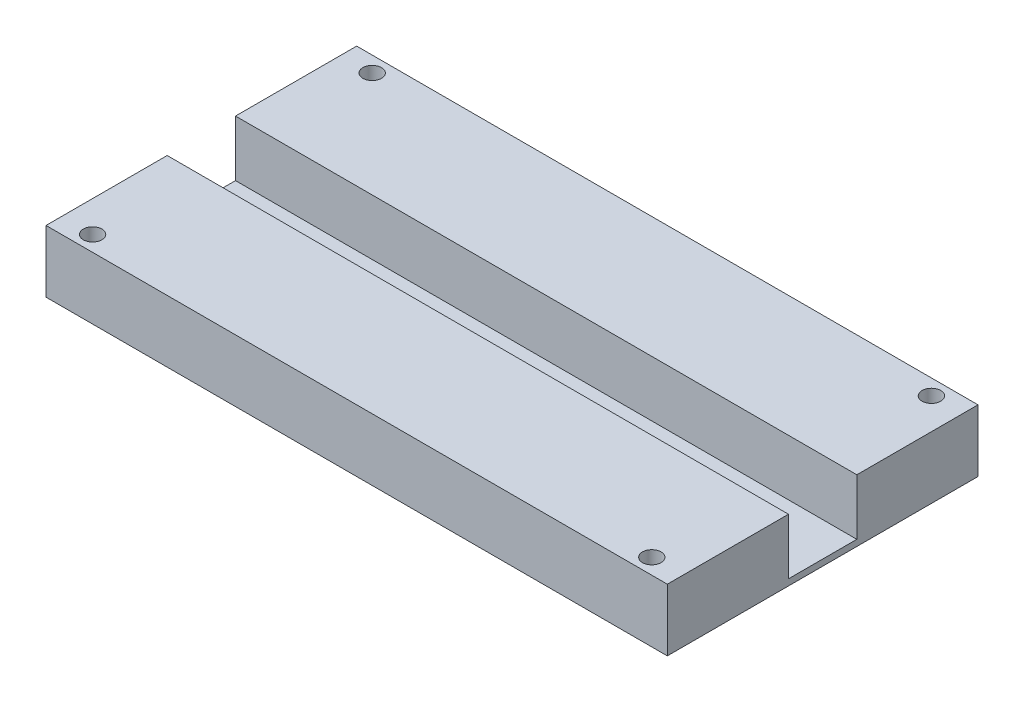
ISO-10303-21;
HEADER;
FILE_DESCRIPTION(('STEP AP214'),'2;1');
FILE_NAME('part.step','',(''),(''),'','','');
FILE_SCHEMA(('AUTOMOTIVE_DESIGN { 1 0 10303 214 1 1 1 1 }'));
ENDSEC;
DATA;
#1=APPLICATION_CONTEXT('core data for automotive mechanical design processes');
#2=APPLICATION_PROTOCOL_DEFINITION('international standard','automotive_design',2000,#1);
#3=PRODUCT_CONTEXT('',#1,'mechanical');
#4=PRODUCT('Part','Part','',(#3));
#5=PRODUCT_RELATED_PRODUCT_CATEGORY('part','',(#4));
#6=PRODUCT_DEFINITION_FORMATION('','',#4);
#7=PRODUCT_DEFINITION_CONTEXT('part definition',#1,'design');
#8=PRODUCT_DEFINITION('design','',#6,#7);
#9=PRODUCT_DEFINITION_SHAPE('','',#8);
#10=(LENGTH_UNIT() NAMED_UNIT(*) SI_UNIT(.MILLI.,.METRE.));
#11=(NAMED_UNIT(*) PLANE_ANGLE_UNIT() SI_UNIT($,.RADIAN.));
#12=(NAMED_UNIT(*) SI_UNIT($,.STERADIAN.) SOLID_ANGLE_UNIT());
#13=UNCERTAINTY_MEASURE_WITH_UNIT(LENGTH_MEASURE(1.E-05),#10,'distance_accuracy_value','');
#14=(GEOMETRIC_REPRESENTATION_CONTEXT(3) GLOBAL_UNCERTAINTY_ASSIGNED_CONTEXT((#13)) GLOBAL_UNIT_ASSIGNED_CONTEXT((#10,
#11,#12)) REPRESENTATION_CONTEXT('',''));
#15=CARTESIAN_POINT('',(0.,0.,0.));
#16=DIRECTION('',(0.,0.,1.));
#17=DIRECTION('',(1.,0.,0.));
#18=AXIS2_PLACEMENT_3D('',#15,#16,#17);
#19=CARTESIAN_POINT('',(0.,10.,0.));
#20=DIRECTION('',(0.,-1.,0.));
#21=DIRECTION('',(0.,0.,-1.));
#22=AXIS2_PLACEMENT_3D('',#19,#20,#21);
#23=PLANE('',#22);
#24=CARTESIAN_POINT('',(64.9999999999999,10.,27.5));
#25=DIRECTION('',(0.,1.,0.));
#26=DIRECTION('',(0.,0.,1.));
#27=AXIS2_PLACEMENT_3D('',#24,#25,#26);
#28=CIRCLE('',#27,1.5);
#29=CARTESIAN_POINT('',(64.9999999999999,10.,29.));
#30=VERTEX_POINT('',#29);
#31=EDGE_CURVE('E135',#30,#30,#28,.T.);
#32=ORIENTED_EDGE('',*,*,#31,.F.);
#33=EDGE_LOOP('',(#32));
#34=FACE_BOUND('',#33,.T.);
#35=CARTESIAN_POINT('',(-25.,10.,27.5));
#36=DIRECTION('',(0.,1.,0.));
#37=DIRECTION('',(0.,0.,1.));
#38=AXIS2_PLACEMENT_3D('',#35,#36,#37);
#39=CIRCLE('',#38,1.5);
#40=CARTESIAN_POINT('',(-25.,10.,29.));
#41=VERTEX_POINT('',#40);
#42=EDGE_CURVE('E149',#41,#41,#39,.T.);
#43=ORIENTED_EDGE('',*,*,#42,.F.);
#44=EDGE_LOOP('',(#43));
#45=FACE_BOUND('',#44,.T.);
#46=DIRECTION('',(0.,0.,-1.));
#47=VECTOR('',#46,1.);
#48=CARTESIAN_POINT('',(70.,10.,30.));
#49=LINE('',#48,#47);
#50=CARTESIAN_POINT('',(70.,10.,30.));
#51=VERTEX_POINT('',#50);
#52=CARTESIAN_POINT('',(70.,10.,10.5));
#53=VERTEX_POINT('',#52);
#54=EDGE_CURVE('E161',#51,#53,#49,.T.);
#55=ORIENTED_EDGE('',*,*,#54,.T.);
#56=DIRECTION('',(1.,0.,0.));
#57=VECTOR('',#56,1.);
#58=CARTESIAN_POINT('',(70.,10.,10.5));
#59=LINE('',#58,#57);
#60=CARTESIAN_POINT('',(-30.0000000000001,10.,10.5));
#61=VERTEX_POINT('',#60);
#62=EDGE_CURVE('E126',#61,#53,#59,.T.);
#63=ORIENTED_EDGE('',*,*,#62,.F.);
#64=DIRECTION('',(0.,0.,1.));
#65=VECTOR('',#64,1.);
#66=CARTESIAN_POINT('',(-30.0000000000001,10.,30.));
#67=LINE('',#66,#65);
#68=CARTESIAN_POINT('',(-30.0000000000001,10.,30.));
#69=VERTEX_POINT('',#68);
#70=EDGE_CURVE('E165',#61,#69,#67,.T.);
#71=ORIENTED_EDGE('',*,*,#70,.T.);
#72=DIRECTION('',(1.,0.,0.));
#73=VECTOR('',#72,1.);
#74=CARTESIAN_POINT('',(-30.0000000000001,10.,30.));
#75=LINE('',#74,#73);
#76=EDGE_CURVE('E60',#69,#51,#75,.T.);
#77=ORIENTED_EDGE('',*,*,#76,.T.);
#78=EDGE_LOOP('',(#55,#63,#71,#77));
#79=FACE_BOUND('',#78,.T.);
#80=ADVANCED_FACE('F36',(#34,#45,#79),#23,.F.);
#81=CARTESIAN_POINT('',(-30.0000000000001,10.,-20.));
#82=VERTEX_POINT('',#81);
#83=CARTESIAN_POINT('',(-30.0000000000001,10.,-0.499999999999985));
#84=VERTEX_POINT('',#83);
#85=EDGE_CURVE('E166',#82,#84,#67,.T.);
#86=ORIENTED_EDGE('',*,*,#85,.T.);
#87=DIRECTION('',(-1.,0.,0.));
#88=VECTOR('',#87,1.);
#89=CARTESIAN_POINT('',(70.,10.,-0.499999999999997));
#90=LINE('',#89,#88);
#91=CARTESIAN_POINT('',(70.,10.,-0.499999999999997));
#92=VERTEX_POINT('',#91);
#93=EDGE_CURVE('E198',#92,#84,#90,.T.);
#94=ORIENTED_EDGE('',*,*,#93,.F.);
#95=CARTESIAN_POINT('',(70.,10.,-20.));
#96=VERTEX_POINT('',#95);
#97=EDGE_CURVE('E89',#92,#96,#49,.T.);
#98=ORIENTED_EDGE('',*,*,#97,.T.);
#99=DIRECTION('',(-1.,0.,0.));
#100=VECTOR('',#99,1.);
#101=CARTESIAN_POINT('',(-30.0000000000001,10.,-20.));
#102=LINE('',#101,#100);
#103=EDGE_CURVE('E163',#96,#82,#102,.T.);
#104=ORIENTED_EDGE('',*,*,#103,.T.);
#105=EDGE_LOOP('',(#86,#94,#98,#104));
#106=FACE_BOUND('',#105,.T.);
#107=CARTESIAN_POINT('',(-25.,10.,-17.5));
#108=DIRECTION('',(0.,1.,0.));
#109=DIRECTION('',(0.,0.,1.));
#110=AXIS2_PLACEMENT_3D('',#107,#108,#109);
#111=CIRCLE('',#110,1.5);
#112=CARTESIAN_POINT('',(-25.,10.,-16.));
#113=VERTEX_POINT('',#112);
#114=EDGE_CURVE('E155',#113,#113,#111,.T.);
#115=ORIENTED_EDGE('',*,*,#114,.F.);
#116=EDGE_LOOP('',(#115));
#117=FACE_BOUND('',#116,.T.);
#118=CARTESIAN_POINT('',(64.9999999999999,10.,-17.5));
#119=DIRECTION('',(0.,1.,0.));
#120=DIRECTION('',(0.,0.,1.));
#121=AXIS2_PLACEMENT_3D('',#118,#119,#120);
#122=CIRCLE('',#121,1.5);
#123=CARTESIAN_POINT('',(64.9999999999999,10.,-16.));
#124=VERTEX_POINT('',#123);
#125=EDGE_CURVE('E143',#124,#124,#122,.T.);
#126=ORIENTED_EDGE('',*,*,#125,.F.);
#127=EDGE_LOOP('',(#126));
#128=FACE_BOUND('',#127,.T.);
#129=ADVANCED_FACE('F216',(#106,#117,#128),#23,.F.);
#130=CARTESIAN_POINT('',(0.,0.,0.));
#131=DIRECTION('',(0.,-1.,0.));
#132=DIRECTION('',(0.,0.,-1.));
#133=AXIS2_PLACEMENT_3D('',#130,#131,#132);
#134=PLANE('',#133);
#135=CARTESIAN_POINT('',(64.9999999999999,0.,-17.5));
#136=DIRECTION('',(0.,1.,0.));
#137=DIRECTION('',(0.,0.,1.));
#138=AXIS2_PLACEMENT_3D('',#135,#136,#137);
#139=CIRCLE('',#138,1.5);
#140=CARTESIAN_POINT('',(64.9999999999999,0.,-16.));
#141=VERTEX_POINT('',#140);
#142=EDGE_CURVE('E138',#141,#141,#139,.T.);
#143=ORIENTED_EDGE('',*,*,#142,.T.);
#144=EDGE_LOOP('',(#143));
#145=FACE_BOUND('',#144,.T.);
#146=CARTESIAN_POINT('',(-25.,0.,-17.5));
#147=DIRECTION('',(0.,1.,0.));
#148=DIRECTION('',(0.,0.,1.));
#149=AXIS2_PLACEMENT_3D('',#146,#147,#148);
#150=CIRCLE('',#149,1.5);
#151=CARTESIAN_POINT('',(-25.,0.,-16.));
#152=VERTEX_POINT('',#151);
#153=EDGE_CURVE('E152',#152,#152,#150,.T.);
#154=ORIENTED_EDGE('',*,*,#153,.T.);
#155=EDGE_LOOP('',(#154));
#156=FACE_BOUND('',#155,.T.);
#157=DIRECTION('',(0.,0.,-1.));
#158=VECTOR('',#157,1.);
#159=CARTESIAN_POINT('',(70.,0.,30.));
#160=LINE('',#159,#158);
#161=CARTESIAN_POINT('',(70.,0.,30.));
#162=VERTEX_POINT('',#161);
#163=CARTESIAN_POINT('',(70.,0.,-20.));
#164=VERTEX_POINT('',#163);
#165=EDGE_CURVE('E158',#162,#164,#160,.T.);
#166=ORIENTED_EDGE('',*,*,#165,.F.);
#167=DIRECTION('',(1.,0.,0.));
#168=VECTOR('',#167,1.);
#169=CARTESIAN_POINT('',(-30.0000000000001,0.,30.));
#170=LINE('',#169,#168);
#171=CARTESIAN_POINT('',(-30.0000000000001,0.,30.));
#172=VERTEX_POINT('',#171);
#173=EDGE_CURVE('E81',#172,#162,#170,.T.);
#174=ORIENTED_EDGE('',*,*,#173,.F.);
#175=DIRECTION('',(0.,0.,1.));
#176=VECTOR('',#175,1.);
#177=CARTESIAN_POINT('',(-30.0000000000001,0.,30.));
#178=LINE('',#177,#176);
#179=CARTESIAN_POINT('',(-30.0000000000001,0.,-20.));
#180=VERTEX_POINT('',#179);
#181=EDGE_CURVE('E175',#180,#172,#178,.T.);
#182=ORIENTED_EDGE('',*,*,#181,.F.);
#183=DIRECTION('',(-1.,0.,0.));
#184=VECTOR('',#183,1.);
#185=CARTESIAN_POINT('',(-30.0000000000001,0.,-20.));
#186=LINE('',#185,#184);
#187=EDGE_CURVE('E173',#164,#180,#186,.T.);
#188=ORIENTED_EDGE('',*,*,#187,.F.);
#189=EDGE_LOOP('',(#166,#174,#182,#188));
#190=FACE_BOUND('',#189,.T.);
#191=CARTESIAN_POINT('',(-25.,0.,27.5));
#192=DIRECTION('',(0.,1.,0.));
#193=DIRECTION('',(0.,0.,1.));
#194=AXIS2_PLACEMENT_3D('',#191,#192,#193);
#195=CIRCLE('',#194,1.5);
#196=CARTESIAN_POINT('',(-25.,0.,29.));
#197=VERTEX_POINT('',#196);
#198=EDGE_CURVE('E146',#197,#197,#195,.T.);
#199=ORIENTED_EDGE('',*,*,#198,.T.);
#200=EDGE_LOOP('',(#199));
#201=FACE_BOUND('',#200,.T.);
#202=CARTESIAN_POINT('',(64.9999999999999,0.,27.5));
#203=DIRECTION('',(0.,1.,0.));
#204=DIRECTION('',(0.,0.,1.));
#205=AXIS2_PLACEMENT_3D('',#202,#203,#204);
#206=CIRCLE('',#205,1.5);
#207=CARTESIAN_POINT('',(64.9999999999999,0.,29.));
#208=VERTEX_POINT('',#207);
#209=EDGE_CURVE('E139',#208,#208,#206,.T.);
#210=ORIENTED_EDGE('',*,*,#209,.T.);
#211=EDGE_LOOP('',(#210));
#212=FACE_BOUND('',#211,.T.);
#213=ADVANCED_FACE('F191',(#145,#156,#190,#201,#212),#134,.T.);
#214=CARTESIAN_POINT('',(70.,10.,30.));
#215=DIRECTION('',(-1.,0.,0.));
#216=DIRECTION('',(0.,0.,1.));
#217=AXIS2_PLACEMENT_3D('',#214,#215,#216);
#218=PLANE('',#217);
#219=DIRECTION('',(0.,0.,-1.));
#220=VECTOR('',#219,1.);
#221=CARTESIAN_POINT('',(70.,1.,-0.499999999999997));
#222=LINE('',#221,#220);
#223=CARTESIAN_POINT('',(70.,1.,10.5));
#224=VERTEX_POINT('',#223);
#225=CARTESIAN_POINT('',(70.,1.,-0.499999999999997));
#226=VERTEX_POINT('',#225);
#227=EDGE_CURVE('E117',#224,#226,#222,.T.);
#228=ORIENTED_EDGE('',*,*,#227,.F.);
#229=DIRECTION('',(0.,1.,0.));
#230=VECTOR('',#229,1.);
#231=CARTESIAN_POINT('',(70.,1.,10.5));
#232=LINE('',#231,#230);
#233=EDGE_CURVE('E142',#224,#53,#232,.T.);
#234=ORIENTED_EDGE('',*,*,#233,.T.);
#235=ORIENTED_EDGE('',*,*,#54,.F.);
#236=DIRECTION('',(0.,-1.,0.));
#237=VECTOR('',#236,1.);
#238=CARTESIAN_POINT('',(70.,10.,30.));
#239=LINE('',#238,#237);
#240=EDGE_CURVE('E170',#51,#162,#239,.T.);
#241=ORIENTED_EDGE('',*,*,#240,.T.);
#242=ORIENTED_EDGE('',*,*,#165,.T.);
#243=DIRECTION('',(0.,-1.,0.));
#244=VECTOR('',#243,1.);
#245=CARTESIAN_POINT('',(70.,10.,-20.));
#246=LINE('',#245,#244);
#247=EDGE_CURVE('E11',#96,#164,#246,.T.);
#248=ORIENTED_EDGE('',*,*,#247,.F.);
#249=ORIENTED_EDGE('',*,*,#97,.F.);
#250=DIRECTION('',(0.,1.,0.));
#251=VECTOR('',#250,1.);
#252=CARTESIAN_POINT('',(70.,1.,-0.499999999999997));
#253=LINE('',#252,#251);
#254=EDGE_CURVE('E112',#226,#92,#253,.T.);
#255=ORIENTED_EDGE('',*,*,#254,.F.);
#256=EDGE_LOOP('',(#228,#234,#235,#241,#242,#248,#249,#255));
#257=FACE_BOUND('',#256,.T.);
#258=ADVANCED_FACE('F38',(#257),#218,.F.);
#259=CARTESIAN_POINT('',(-30.0000000000001,10.,-20.));
#260=DIRECTION('',(0.,0.,1.));
#261=DIRECTION('',(1.,0.,0.));
#262=AXIS2_PLACEMENT_3D('',#259,#260,#261);
#263=PLANE('',#262);
#264=ORIENTED_EDGE('',*,*,#187,.T.);
#265=DIRECTION('',(0.,-1.,0.));
#266=VECTOR('',#265,1.);
#267=CARTESIAN_POINT('',(-30.0000000000001,10.,-20.));
#268=LINE('',#267,#266);
#269=EDGE_CURVE('E44',#82,#180,#268,.T.);
#270=ORIENTED_EDGE('',*,*,#269,.F.);
#271=ORIENTED_EDGE('',*,*,#103,.F.);
#272=ORIENTED_EDGE('',*,*,#247,.T.);
#273=EDGE_LOOP('',(#264,#270,#271,#272));
#274=FACE_BOUND('',#273,.T.);
#275=ADVANCED_FACE('F234',(#274),#263,.F.);
#276=CARTESIAN_POINT('',(-30.0000000000001,10.,30.));
#277=DIRECTION('',(1.,0.,0.));
#278=DIRECTION('',(0.,0.,-1.));
#279=AXIS2_PLACEMENT_3D('',#276,#277,#278);
#280=PLANE('',#279);
#281=ORIENTED_EDGE('',*,*,#70,.F.);
#282=DIRECTION('',(0.,1.,0.));
#283=VECTOR('',#282,1.);
#284=CARTESIAN_POINT('',(-30.0000000000001,1.,10.5));
#285=LINE('',#284,#283);
#286=CARTESIAN_POINT('',(-30.0000000000001,1.,10.5));
#287=VERTEX_POINT('',#286);
#288=EDGE_CURVE('E130',#287,#61,#285,.T.);
#289=ORIENTED_EDGE('',*,*,#288,.F.);
#290=DIRECTION('',(0.,0.,1.));
#291=VECTOR('',#290,1.);
#292=CARTESIAN_POINT('',(-30.0000000000001,1.,-0.499999999999985));
#293=LINE('',#292,#291);
#294=CARTESIAN_POINT('',(-30.0000000000001,1.,-0.499999999999997));
#295=VERTEX_POINT('',#294);
#296=EDGE_CURVE('E116',#295,#287,#293,.T.);
#297=ORIENTED_EDGE('',*,*,#296,.F.);
#298=DIRECTION('',(0.,1.,0.));
#299=VECTOR('',#298,1.);
#300=CARTESIAN_POINT('',(-30.0000000000001,1.,-0.499999999999985));
#301=LINE('',#300,#299);
#302=EDGE_CURVE('E114',#295,#84,#301,.T.);
#303=ORIENTED_EDGE('',*,*,#302,.T.);
#304=ORIENTED_EDGE('',*,*,#85,.F.);
#305=ORIENTED_EDGE('',*,*,#269,.T.);
#306=ORIENTED_EDGE('',*,*,#181,.T.);
#307=DIRECTION('',(0.,-1.,0.));
#308=VECTOR('',#307,1.);
#309=CARTESIAN_POINT('',(-30.0000000000001,10.,30.));
#310=LINE('',#309,#308);
#311=EDGE_CURVE('E179',#69,#172,#310,.T.);
#312=ORIENTED_EDGE('',*,*,#311,.F.);
#313=EDGE_LOOP('',(#281,#289,#297,#303,#304,#305,#306,#312));
#314=FACE_BOUND('',#313,.T.);
#315=ADVANCED_FACE('F186',(#314),#280,.F.);
#316=CARTESIAN_POINT('',(-30.0000000000001,10.,30.));
#317=DIRECTION('',(0.,0.,-1.));
#318=DIRECTION('',(-1.,0.,0.));
#319=AXIS2_PLACEMENT_3D('',#316,#317,#318);
#320=PLANE('',#319);
#321=ORIENTED_EDGE('',*,*,#173,.T.);
#322=ORIENTED_EDGE('',*,*,#240,.F.);
#323=ORIENTED_EDGE('',*,*,#76,.F.);
#324=ORIENTED_EDGE('',*,*,#311,.T.);
#325=EDGE_LOOP('',(#321,#322,#323,#324));
#326=FACE_BOUND('',#325,.T.);
#327=ADVANCED_FACE('F194',(#326),#320,.F.);
#328=CARTESIAN_POINT('',(-25.,10.,-17.5));
#329=DIRECTION('',(0.,-1.,0.));
#330=DIRECTION('',(0.,0.,-1.));
#331=AXIS2_PLACEMENT_3D('',#328,#329,#330);
#332=CYLINDRICAL_SURFACE('',#331,1.5);
#333=ORIENTED_EDGE('',*,*,#114,.T.);
#334=EDGE_LOOP('',(#333));
#335=FACE_BOUND('',#334,.T.);
#336=ORIENTED_EDGE('',*,*,#153,.F.);
#337=EDGE_LOOP('',(#336));
#338=FACE_BOUND('',#337,.T.);
#339=ADVANCED_FACE('F226',(#335,#338),#332,.F.);
#340=CARTESIAN_POINT('',(-25.,10.,27.5));
#341=DIRECTION('',(0.,-1.,0.));
#342=DIRECTION('',(0.,0.,-1.));
#343=AXIS2_PLACEMENT_3D('',#340,#341,#342);
#344=CYLINDRICAL_SURFACE('',#343,1.5);
#345=ORIENTED_EDGE('',*,*,#42,.T.);
#346=EDGE_LOOP('',(#345));
#347=FACE_BOUND('',#346,.T.);
#348=ORIENTED_EDGE('',*,*,#198,.F.);
#349=EDGE_LOOP('',(#348));
#350=FACE_BOUND('',#349,.T.);
#351=ADVANCED_FACE('F247',(#347,#350),#344,.F.);
#352=CARTESIAN_POINT('',(64.9999999999999,10.,-17.5));
#353=DIRECTION('',(0.,-1.,0.));
#354=DIRECTION('',(0.,0.,-1.));
#355=AXIS2_PLACEMENT_3D('',#352,#353,#354);
#356=CYLINDRICAL_SURFACE('',#355,1.5);
#357=ORIENTED_EDGE('',*,*,#125,.T.);
#358=EDGE_LOOP('',(#357));
#359=FACE_BOUND('',#358,.T.);
#360=ORIENTED_EDGE('',*,*,#142,.F.);
#361=EDGE_LOOP('',(#360));
#362=FACE_BOUND('',#361,.T.);
#363=ADVANCED_FACE('F211',(#359,#362),#356,.F.);
#364=CARTESIAN_POINT('',(64.9999999999999,10.,27.5));
#365=DIRECTION('',(0.,-1.,0.));
#366=DIRECTION('',(0.,0.,-1.));
#367=AXIS2_PLACEMENT_3D('',#364,#365,#366);
#368=CYLINDRICAL_SURFACE('',#367,1.5);
#369=ORIENTED_EDGE('',*,*,#31,.T.);
#370=EDGE_LOOP('',(#369));
#371=FACE_BOUND('',#370,.T.);
#372=ORIENTED_EDGE('',*,*,#209,.F.);
#373=EDGE_LOOP('',(#372));
#374=FACE_BOUND('',#373,.T.);
#375=ADVANCED_FACE('F204',(#371,#374),#368,.F.);
#376=CARTESIAN_POINT('',(70.,1.,10.5));
#377=DIRECTION('',(0.,0.,1.));
#378=DIRECTION('',(1.,0.,0.));
#379=AXIS2_PLACEMENT_3D('',#376,#377,#378);
#380=PLANE('',#379);
#381=ORIENTED_EDGE('',*,*,#62,.T.);
#382=ORIENTED_EDGE('',*,*,#233,.F.);
#383=DIRECTION('',(1.,0.,0.));
#384=VECTOR('',#383,1.);
#385=CARTESIAN_POINT('',(70.,1.,10.5));
#386=LINE('',#385,#384);
#387=EDGE_CURVE('E123',#287,#224,#386,.T.);
#388=ORIENTED_EDGE('',*,*,#387,.F.);
#389=ORIENTED_EDGE('',*,*,#288,.T.);
#390=EDGE_LOOP('',(#381,#382,#388,#389));
#391=FACE_BOUND('',#390,.T.);
#392=ADVANCED_FACE('F202',(#391),#380,.F.);
#393=CARTESIAN_POINT('',(70.,1.,-0.499999999999997));
#394=DIRECTION('',(0.,0.,-1.));
#395=DIRECTION('',(-1.,0.,0.));
#396=AXIS2_PLACEMENT_3D('',#393,#394,#395);
#397=PLANE('',#396);
#398=ORIENTED_EDGE('',*,*,#93,.T.);
#399=ORIENTED_EDGE('',*,*,#302,.F.);
#400=DIRECTION('',(-1.,0.,0.));
#401=VECTOR('',#400,1.);
#402=CARTESIAN_POINT('',(70.,1.,-0.499999999999997));
#403=LINE('',#402,#401);
#404=EDGE_CURVE('E51',#226,#295,#403,.T.);
#405=ORIENTED_EDGE('',*,*,#404,.F.);
#406=ORIENTED_EDGE('',*,*,#254,.T.);
#407=EDGE_LOOP('',(#398,#399,#405,#406));
#408=FACE_BOUND('',#407,.T.);
#409=ADVANCED_FACE('F110',(#408),#397,.F.);
#410=CARTESIAN_POINT('',(0.,1.,0.));
#411=DIRECTION('',(0.,-1.,0.));
#412=DIRECTION('',(0.,0.,-1.));
#413=AXIS2_PLACEMENT_3D('',#410,#411,#412);
#414=PLANE('',#413);
#415=ORIENTED_EDGE('',*,*,#227,.T.);
#416=ORIENTED_EDGE('',*,*,#404,.T.);
#417=ORIENTED_EDGE('',*,*,#296,.T.);
#418=ORIENTED_EDGE('',*,*,#387,.T.);
#419=EDGE_LOOP('',(#415,#416,#417,#418));
#420=FACE_BOUND('',#419,.T.);
#421=ADVANCED_FACE('F121',(#420),#414,.F.);
#422=CLOSED_SHELL('',(#80,#129,#213,#258,#275,#315,#327,#339,#351,#363,#375,#392,#409,#421));
#423=MANIFOLD_SOLID_BREP('B2',#422);
#424=ADVANCED_BREP_SHAPE_REPRESENTATION('',(#18,#423),#14);
#425=SHAPE_DEFINITION_REPRESENTATION(#9,#424);
ENDSEC;
END-ISO-10303-21;
